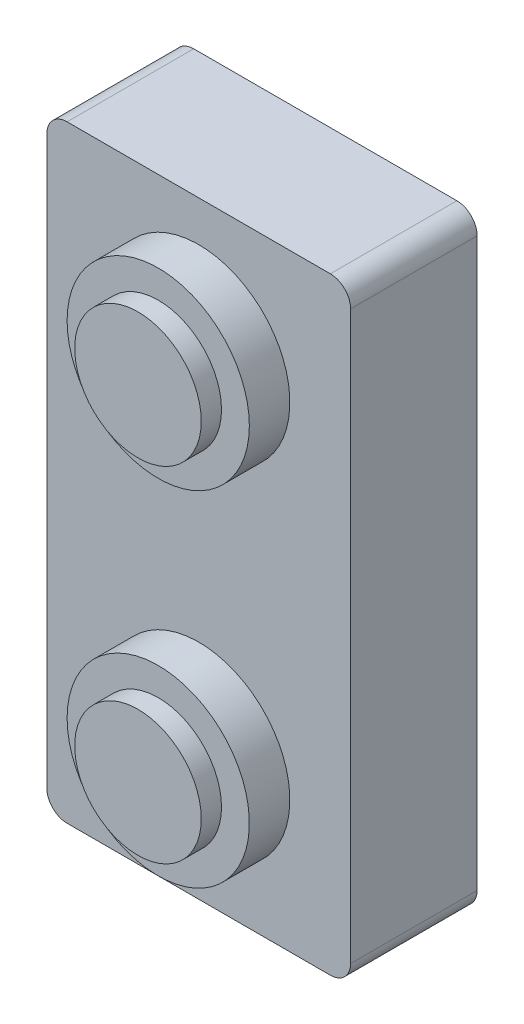
ISO-10303-21;
HEADER;
FILE_DESCRIPTION(('STEP AP214'),'2;1');
FILE_NAME('part.step','',(''),(''),'','','');
FILE_SCHEMA(('AUTOMOTIVE_DESIGN { 1 0 10303 214 1 1 1 1 }'));
ENDSEC;
DATA;
#1=APPLICATION_CONTEXT('core data for automotive mechanical design processes');
#2=APPLICATION_PROTOCOL_DEFINITION('international standard','automotive_design',2000,#1);
#3=PRODUCT_CONTEXT('',#1,'mechanical');
#4=PRODUCT('Part','Part','',(#3));
#5=PRODUCT_RELATED_PRODUCT_CATEGORY('part','',(#4));
#6=PRODUCT_DEFINITION_FORMATION('','',#4);
#7=PRODUCT_DEFINITION_CONTEXT('part definition',#1,'design');
#8=PRODUCT_DEFINITION('design','',#6,#7);
#9=PRODUCT_DEFINITION_SHAPE('','',#8);
#10=(LENGTH_UNIT() NAMED_UNIT(*) SI_UNIT(.MILLI.,.METRE.));
#11=(NAMED_UNIT(*) PLANE_ANGLE_UNIT() SI_UNIT($,.RADIAN.));
#12=(NAMED_UNIT(*) SI_UNIT($,.STERADIAN.) SOLID_ANGLE_UNIT());
#13=UNCERTAINTY_MEASURE_WITH_UNIT(LENGTH_MEASURE(1.E-05),#10,'distance_accuracy_value','');
#14=(GEOMETRIC_REPRESENTATION_CONTEXT(3) GLOBAL_UNCERTAINTY_ASSIGNED_CONTEXT((#13)) GLOBAL_UNIT_ASSIGNED_CONTEXT((#10,
#11,#12)) REPRESENTATION_CONTEXT('',''));
#15=CARTESIAN_POINT('',(0.,0.,0.));
#16=DIRECTION('',(0.,0.,1.));
#17=DIRECTION('',(1.,0.,0.));
#18=AXIS2_PLACEMENT_3D('',#15,#16,#17);
#19=CARTESIAN_POINT('',(15.,30.,12.5));
#20=DIRECTION('',(-1.,0.,0.));
#21=DIRECTION('',(0.,-1.,0.));
#22=AXIS2_PLACEMENT_3D('',#19,#20,#21);
#23=PLANE('',#22);
#24=DIRECTION('',(0.,1.,0.));
#25=VECTOR('',#24,1.);
#26=CARTESIAN_POINT('',(15.,30.,0.));
#27=LINE('',#26,#25);
#28=CARTESIAN_POINT('',(15.,-28.,0.));
#29=VERTEX_POINT('',#28);
#30=CARTESIAN_POINT('',(15.,28.,0.));
#31=VERTEX_POINT('',#30);
#32=EDGE_CURVE('E136',#29,#31,#27,.T.);
#33=ORIENTED_EDGE('',*,*,#32,.T.);
#34=DIRECTION('',(0.,0.,-1.));
#35=VECTOR('',#34,1.);
#36=CARTESIAN_POINT('',(15.,28.,12.5));
#37=LINE('',#36,#35);
#38=CARTESIAN_POINT('',(15.,28.,12.5));
#39=VERTEX_POINT('',#38);
#40=EDGE_CURVE('E166',#31,#39,#37,.F.);
#41=ORIENTED_EDGE('',*,*,#40,.T.);
#42=DIRECTION('',(0.,1.,0.));
#43=VECTOR('',#42,1.);
#44=CARTESIAN_POINT('',(15.,30.,12.5));
#45=LINE('',#44,#43);
#46=CARTESIAN_POINT('',(15.,-28.,12.5));
#47=VERTEX_POINT('',#46);
#48=EDGE_CURVE('E134',#47,#39,#45,.T.);
#49=ORIENTED_EDGE('',*,*,#48,.F.);
#50=DIRECTION('',(0.,0.,-1.));
#51=VECTOR('',#50,1.);
#52=CARTESIAN_POINT('',(15.,-28.,12.5));
#53=LINE('',#52,#51);
#54=EDGE_CURVE('E163',#47,#29,#53,.T.);
#55=ORIENTED_EDGE('',*,*,#54,.T.);
#56=EDGE_LOOP('',(#33,#41,#49,#55));
#57=FACE_BOUND('',#56,.T.);
#58=ADVANCED_FACE('F39',(#57),#23,.F.);
#59=CARTESIAN_POINT('',(15.,30.,12.5));
#60=DIRECTION('',(0.,-1.,0.));
#61=DIRECTION('',(1.,0.,0.));
#62=AXIS2_PLACEMENT_3D('',#59,#60,#61);
#63=PLANE('',#62);
#64=DIRECTION('',(-1.,0.,0.));
#65=VECTOR('',#64,1.);
#66=CARTESIAN_POINT('',(15.,30.,0.));
#67=LINE('',#66,#65);
#68=CARTESIAN_POINT('',(13.,30.,0.));
#69=VERTEX_POINT('',#68);
#70=CARTESIAN_POINT('',(-13.,30.,0.));
#71=VERTEX_POINT('',#70);
#72=EDGE_CURVE('E132',#69,#71,#67,.T.);
#73=ORIENTED_EDGE('',*,*,#72,.T.);
#74=DIRECTION('',(0.,0.,-1.));
#75=VECTOR('',#74,1.);
#76=CARTESIAN_POINT('',(-13.,30.,12.5));
#77=LINE('',#76,#75);
#78=CARTESIAN_POINT('',(-13.,30.,12.5));
#79=VERTEX_POINT('',#78);
#80=EDGE_CURVE('E110',#71,#79,#77,.F.);
#81=ORIENTED_EDGE('',*,*,#80,.T.);
#82=DIRECTION('',(-1.,0.,0.));
#83=VECTOR('',#82,1.);
#84=CARTESIAN_POINT('',(15.,30.,12.5));
#85=LINE('',#84,#83);
#86=CARTESIAN_POINT('',(13.,30.,12.5));
#87=VERTEX_POINT('',#86);
#88=EDGE_CURVE('E180',#87,#79,#85,.T.);
#89=ORIENTED_EDGE('',*,*,#88,.F.);
#90=DIRECTION('',(0.,0.,-1.));
#91=VECTOR('',#90,1.);
#92=CARTESIAN_POINT('',(13.,30.,12.5));
#93=LINE('',#92,#91);
#94=EDGE_CURVE('E115',#87,#69,#93,.T.);
#95=ORIENTED_EDGE('',*,*,#94,.T.);
#96=EDGE_LOOP('',(#73,#81,#89,#95));
#97=FACE_BOUND('',#96,.T.);
#98=ADVANCED_FACE('F185',(#97),#63,.F.);
#99=CARTESIAN_POINT('',(-15.,30.,12.5));
#100=DIRECTION('',(1.,0.,0.));
#101=DIRECTION('',(0.,0.,-1.));
#102=AXIS2_PLACEMENT_3D('',#99,#100,#101);
#103=PLANE('',#102);
#104=CARTESIAN_POINT('',(-15.,0.,6.25));
#105=DIRECTION('',(-1.,0.,0.));
#106=DIRECTION('',(0.,0.,1.));
#107=AXIS2_PLACEMENT_3D('',#104,#105,#106);
#108=CIRCLE('',#107,4.);
#109=CARTESIAN_POINT('',(-15.,0.,10.25));
#110=VERTEX_POINT('',#109);
#111=EDGE_CURVE('E207',#110,#110,#108,.T.);
#112=ORIENTED_EDGE('',*,*,#111,.F.);
#113=EDGE_LOOP('',(#112));
#114=FACE_BOUND('',#113,.T.);
#115=DIRECTION('',(0.,-1.,0.));
#116=VECTOR('',#115,1.);
#117=CARTESIAN_POINT('',(-15.,30.,12.5));
#118=LINE('',#117,#116);
#119=CARTESIAN_POINT('',(-15.,28.,12.5));
#120=VERTEX_POINT('',#119);
#121=CARTESIAN_POINT('',(-15.,-28.,12.5));
#122=VERTEX_POINT('',#121);
#123=EDGE_CURVE('E124',#120,#122,#118,.T.);
#124=ORIENTED_EDGE('',*,*,#123,.F.);
#125=DIRECTION('',(0.,0.,-1.));
#126=VECTOR('',#125,1.);
#127=CARTESIAN_POINT('',(-15.,28.,12.5));
#128=LINE('',#127,#126);
#129=CARTESIAN_POINT('',(-15.,28.,0.));
#130=VERTEX_POINT('',#129);
#131=EDGE_CURVE('E109',#120,#130,#128,.T.);
#132=ORIENTED_EDGE('',*,*,#131,.T.);
#133=DIRECTION('',(0.,-1.,0.));
#134=VECTOR('',#133,1.);
#135=CARTESIAN_POINT('',(-15.,30.,0.));
#136=LINE('',#135,#134);
#137=CARTESIAN_POINT('',(-15.,-28.,0.));
#138=VERTEX_POINT('',#137);
#139=EDGE_CURVE('E122',#130,#138,#136,.T.);
#140=ORIENTED_EDGE('',*,*,#139,.T.);
#141=DIRECTION('',(0.,0.,-1.));
#142=VECTOR('',#141,1.);
#143=CARTESIAN_POINT('',(-15.,-28.,12.5));
#144=LINE('',#143,#142);
#145=EDGE_CURVE('E126',#138,#122,#144,.F.);
#146=ORIENTED_EDGE('',*,*,#145,.T.);
#147=EDGE_LOOP('',(#124,#132,#140,#146));
#148=FACE_BOUND('',#147,.T.);
#149=ADVANCED_FACE('F121',(#114,#148),#103,.F.);
#150=CARTESIAN_POINT('',(15.,-30.,12.5));
#151=DIRECTION('',(0.,1.,0.));
#152=DIRECTION('',(-1.,0.,0.));
#153=AXIS2_PLACEMENT_3D('',#150,#151,#152);
#154=PLANE('',#153);
#155=DIRECTION('',(1.,0.,0.));
#156=VECTOR('',#155,1.);
#157=CARTESIAN_POINT('',(15.,-30.,12.5));
#158=LINE('',#157,#156);
#159=CARTESIAN_POINT('',(-13.,-30.,12.5));
#160=VERTEX_POINT('',#159);
#161=CARTESIAN_POINT('',(13.,-30.,12.5));
#162=VERTEX_POINT('',#161);
#163=EDGE_CURVE('E144',#160,#162,#158,.T.);
#164=ORIENTED_EDGE('',*,*,#163,.F.);
#165=DIRECTION('',(0.,0.,-1.));
#166=VECTOR('',#165,1.);
#167=CARTESIAN_POINT('',(-13.,-30.,12.5));
#168=LINE('',#167,#166);
#169=CARTESIAN_POINT('',(-13.,-30.,0.));
#170=VERTEX_POINT('',#169);
#171=EDGE_CURVE('E11',#160,#170,#168,.T.);
#172=ORIENTED_EDGE('',*,*,#171,.T.);
#173=DIRECTION('',(1.,0.,0.));
#174=VECTOR('',#173,1.);
#175=CARTESIAN_POINT('',(15.,-30.,0.));
#176=LINE('',#175,#174);
#177=CARTESIAN_POINT('',(13.,-30.,0.));
#178=VERTEX_POINT('',#177);
#179=EDGE_CURVE('E131',#170,#178,#176,.T.);
#180=ORIENTED_EDGE('',*,*,#179,.T.);
#181=DIRECTION('',(0.,0.,-1.));
#182=VECTOR('',#181,1.);
#183=CARTESIAN_POINT('',(13.,-30.,12.5));
#184=LINE('',#183,#182);
#185=EDGE_CURVE('E47',#178,#162,#184,.F.);
#186=ORIENTED_EDGE('',*,*,#185,.T.);
#187=EDGE_LOOP('',(#164,#172,#180,#186));
#188=FACE_BOUND('',#187,.T.);
#189=ADVANCED_FACE('F222',(#188),#154,.F.);
#190=CARTESIAN_POINT('',(0.,0.,12.5));
#191=DIRECTION('',(0.,0.,-1.));
#192=DIRECTION('',(-1.,0.,0.));
#193=AXIS2_PLACEMENT_3D('',#190,#191,#192);
#194=PLANE('',#193);
#195=CARTESIAN_POINT('',(0.,-17.,12.5));
#196=DIRECTION('',(0.,0.,-1.));
#197=DIRECTION('',(-1.,0.,0.));
#198=AXIS2_PLACEMENT_3D('',#195,#196,#197);
#199=CIRCLE('',#198,9.);
#200=CARTESIAN_POINT('',(-9.,-17.,12.5));
#201=VERTEX_POINT('',#200);
#202=EDGE_CURVE('E143',#201,#201,#199,.F.);
#203=ORIENTED_EDGE('',*,*,#202,.F.);
#204=EDGE_LOOP('',(#203));
#205=FACE_BOUND('',#204,.T.);
#206=CARTESIAN_POINT('',(0.,17.,12.5));
#207=DIRECTION('',(0.,0.,-1.));
#208=DIRECTION('',(-1.,0.,0.));
#209=AXIS2_PLACEMENT_3D('',#206,#207,#208);
#210=CIRCLE('',#209,9.);
#211=CARTESIAN_POINT('',(-9.,17.,12.5));
#212=VERTEX_POINT('',#211);
#213=EDGE_CURVE('E140',#212,#212,#210,.F.);
#214=ORIENTED_EDGE('',*,*,#213,.F.);
#215=EDGE_LOOP('',(#214));
#216=FACE_BOUND('',#215,.T.);
#217=ORIENTED_EDGE('',*,*,#88,.T.);
#218=CARTESIAN_POINT('',(-13.,28.,12.5));
#219=DIRECTION('',(0.,0.,-1.));
#220=DIRECTION('',(-1.,0.,0.));
#221=AXIS2_PLACEMENT_3D('',#218,#219,#220);
#222=CIRCLE('',#221,2.);
#223=EDGE_CURVE('E161',#79,#120,#222,.F.);
#224=ORIENTED_EDGE('',*,*,#223,.T.);
#225=ORIENTED_EDGE('',*,*,#123,.T.);
#226=CARTESIAN_POINT('',(-13.,-28.,12.5));
#227=DIRECTION('',(0.,0.,-1.));
#228=DIRECTION('',(-1.,0.,0.));
#229=AXIS2_PLACEMENT_3D('',#226,#227,#228);
#230=CIRCLE('',#229,2.);
#231=EDGE_CURVE('E60',#122,#160,#230,.F.);
#232=ORIENTED_EDGE('',*,*,#231,.T.);
#233=ORIENTED_EDGE('',*,*,#163,.T.);
#234=CARTESIAN_POINT('',(13.,-28.,12.5));
#235=DIRECTION('',(0.,0.,-1.));
#236=DIRECTION('',(-1.,0.,0.));
#237=AXIS2_PLACEMENT_3D('',#234,#235,#236);
#238=CIRCLE('',#237,2.);
#239=EDGE_CURVE('E156',#162,#47,#238,.F.);
#240=ORIENTED_EDGE('',*,*,#239,.T.);
#241=ORIENTED_EDGE('',*,*,#48,.T.);
#242=CARTESIAN_POINT('',(13.,28.,12.5));
#243=DIRECTION('',(0.,0.,-1.));
#244=DIRECTION('',(-1.,0.,0.));
#245=AXIS2_PLACEMENT_3D('',#242,#243,#244);
#246=CIRCLE('',#245,2.);
#247=EDGE_CURVE('E159',#39,#87,#246,.F.);
#248=ORIENTED_EDGE('',*,*,#247,.T.);
#249=EDGE_LOOP('',(#217,#224,#225,#232,#233,#240,#241,#248));
#250=FACE_BOUND('',#249,.T.);
#251=ADVANCED_FACE('F177',(#205,#216,#250),#194,.F.);
#252=CARTESIAN_POINT('',(0.,0.,0.));
#253=DIRECTION('',(0.,0.,-1.));
#254=DIRECTION('',(-1.,0.,0.));
#255=AXIS2_PLACEMENT_3D('',#252,#253,#254);
#256=PLANE('',#255);
#257=ORIENTED_EDGE('',*,*,#139,.F.);
#258=CARTESIAN_POINT('',(-13.,28.,0.));
#259=DIRECTION('',(0.,0.,-1.));
#260=DIRECTION('',(-1.,0.,0.));
#261=AXIS2_PLACEMENT_3D('',#258,#259,#260);
#262=CIRCLE('',#261,2.);
#263=EDGE_CURVE('E105',#130,#71,#262,.T.);
#264=ORIENTED_EDGE('',*,*,#263,.T.);
#265=ORIENTED_EDGE('',*,*,#72,.F.);
#266=CARTESIAN_POINT('',(13.,28.,0.));
#267=DIRECTION('',(0.,0.,-1.));
#268=DIRECTION('',(-1.,0.,0.));
#269=AXIS2_PLACEMENT_3D('',#266,#267,#268);
#270=CIRCLE('',#269,2.);
#271=EDGE_CURVE('E116',#69,#31,#270,.T.);
#272=ORIENTED_EDGE('',*,*,#271,.T.);
#273=ORIENTED_EDGE('',*,*,#32,.F.);
#274=CARTESIAN_POINT('',(13.,-28.,0.));
#275=DIRECTION('',(0.,0.,-1.));
#276=DIRECTION('',(-1.,0.,0.));
#277=AXIS2_PLACEMENT_3D('',#274,#275,#276);
#278=CIRCLE('',#277,2.);
#279=EDGE_CURVE('E125',#29,#178,#278,.T.);
#280=ORIENTED_EDGE('',*,*,#279,.T.);
#281=ORIENTED_EDGE('',*,*,#179,.F.);
#282=CARTESIAN_POINT('',(-13.,-28.,0.));
#283=DIRECTION('',(0.,0.,-1.));
#284=DIRECTION('',(-1.,0.,0.));
#285=AXIS2_PLACEMENT_3D('',#282,#283,#284);
#286=CIRCLE('',#285,2.);
#287=EDGE_CURVE('E130',#170,#138,#286,.T.);
#288=ORIENTED_EDGE('',*,*,#287,.T.);
#289=EDGE_LOOP('',(#257,#264,#265,#272,#273,#280,#281,#288));
#290=FACE_BOUND('',#289,.T.);
#291=ADVANCED_FACE('F128',(#290),#256,.T.);
#292=CARTESIAN_POINT('',(0.,17.,16.5));
#293=DIRECTION('',(0.,0.,-1.));
#294=DIRECTION('',(-1.,0.,0.));
#295=AXIS2_PLACEMENT_3D('',#292,#293,#294);
#296=CYLINDRICAL_SURFACE('',#295,9.);
#297=CARTESIAN_POINT('',(0.,17.,16.5));
#298=DIRECTION('',(0.,0.,1.));
#299=DIRECTION('',(1.,0.,0.));
#300=AXIS2_PLACEMENT_3D('',#297,#298,#299);
#301=CIRCLE('',#300,9.);
#302=CARTESIAN_POINT('',(9.,17.,16.5));
#303=VERTEX_POINT('',#302);
#304=EDGE_CURVE('E186',#303,#303,#301,.T.);
#305=ORIENTED_EDGE('',*,*,#304,.F.);
#306=EDGE_LOOP('',(#305));
#307=FACE_BOUND('',#306,.T.);
#308=ORIENTED_EDGE('',*,*,#213,.T.);
#309=EDGE_LOOP('',(#308));
#310=FACE_BOUND('',#309,.T.);
#311=ADVANCED_FACE('F379',(#307,#310),#296,.T.);
#312=CARTESIAN_POINT('',(0.,17.,16.5));
#313=DIRECTION('',(0.,0.,1.));
#314=DIRECTION('',(1.,0.,0.));
#315=AXIS2_PLACEMENT_3D('',#312,#313,#314);
#316=PLANE('',#315);
#317=CARTESIAN_POINT('',(0.,17.,16.5));
#318=DIRECTION('',(0.,0.,1.));
#319=DIRECTION('',(1.,0.,0.));
#320=AXIS2_PLACEMENT_3D('',#317,#318,#319);
#321=CIRCLE('',#320,6.25);
#322=CARTESIAN_POINT('',(6.25,17.,16.5));
#323=VERTEX_POINT('',#322);
#324=EDGE_CURVE('E147',#323,#323,#321,.T.);
#325=ORIENTED_EDGE('',*,*,#324,.F.);
#326=EDGE_LOOP('',(#325));
#327=FACE_BOUND('',#326,.T.);
#328=ORIENTED_EDGE('',*,*,#304,.T.);
#329=EDGE_LOOP('',(#328));
#330=FACE_BOUND('',#329,.T.);
#331=ADVANCED_FACE('F368',(#327,#330),#316,.T.);
#332=CARTESIAN_POINT('',(0.,-17.,16.5));
#333=DIRECTION('',(0.,0.,-1.));
#334=DIRECTION('',(-1.,0.,0.));
#335=AXIS2_PLACEMENT_3D('',#332,#333,#334);
#336=CYLINDRICAL_SURFACE('',#335,9.);
#337=CARTESIAN_POINT('',(0.,-17.,16.5));
#338=DIRECTION('',(0.,0.,1.));
#339=DIRECTION('',(-1.,0.,0.));
#340=AXIS2_PLACEMENT_3D('',#337,#338,#339);
#341=CIRCLE('',#340,9.);
#342=CARTESIAN_POINT('',(-9.,-17.,16.5));
#343=VERTEX_POINT('',#342);
#344=EDGE_CURVE('E188',#343,#343,#341,.T.);
#345=ORIENTED_EDGE('',*,*,#344,.F.);
#346=EDGE_LOOP('',(#345));
#347=FACE_BOUND('',#346,.T.);
#348=ORIENTED_EDGE('',*,*,#202,.T.);
#349=EDGE_LOOP('',(#348));
#350=FACE_BOUND('',#349,.T.);
#351=ADVANCED_FACE('F356',(#347,#350),#336,.T.);
#352=CARTESIAN_POINT('',(0.,-17.,16.5));
#353=DIRECTION('',(0.,0.,-1.));
#354=DIRECTION('',(-1.,0.,0.));
#355=AXIS2_PLACEMENT_3D('',#352,#353,#354);
#356=PLANE('',#355);
#357=CARTESIAN_POINT('',(0.,-17.,16.5));
#358=DIRECTION('',(0.,0.,1.));
#359=DIRECTION('',(1.,0.,0.));
#360=AXIS2_PLACEMENT_3D('',#357,#358,#359);
#361=CIRCLE('',#360,6.25);
#362=CARTESIAN_POINT('',(6.25,-17.,16.5));
#363=VERTEX_POINT('',#362);
#364=EDGE_CURVE('E148',#363,#363,#361,.T.);
#365=ORIENTED_EDGE('',*,*,#364,.F.);
#366=EDGE_LOOP('',(#365));
#367=FACE_BOUND('',#366,.T.);
#368=ORIENTED_EDGE('',*,*,#344,.T.);
#369=EDGE_LOOP('',(#368));
#370=FACE_BOUND('',#369,.T.);
#371=ADVANCED_FACE('F345',(#367,#370),#356,.F.);
#372=CARTESIAN_POINT('',(0.,17.,18.5));
#373=DIRECTION('',(0.,0.,-1.));
#374=DIRECTION('',(-1.,0.,0.));
#375=AXIS2_PLACEMENT_3D('',#372,#373,#374);
#376=CYLINDRICAL_SURFACE('',#375,6.25);
#377=CARTESIAN_POINT('',(0.,17.,18.5));
#378=DIRECTION('',(0.,0.,1.));
#379=DIRECTION('',(1.,0.,0.));
#380=AXIS2_PLACEMENT_3D('',#377,#378,#379);
#381=CIRCLE('',#380,6.25);
#382=CARTESIAN_POINT('',(6.25,17.,18.5));
#383=VERTEX_POINT('',#382);
#384=EDGE_CURVE('E196',#383,#383,#381,.T.);
#385=ORIENTED_EDGE('',*,*,#384,.F.);
#386=EDGE_LOOP('',(#385));
#387=FACE_BOUND('',#386,.T.);
#388=ORIENTED_EDGE('',*,*,#324,.T.);
#389=EDGE_LOOP('',(#388));
#390=FACE_BOUND('',#389,.T.);
#391=ADVANCED_FACE('F334',(#387,#390),#376,.T.);
#392=CARTESIAN_POINT('',(0.,17.,18.5));
#393=DIRECTION('',(0.,0.,1.));
#394=DIRECTION('',(1.,0.,0.));
#395=AXIS2_PLACEMENT_3D('',#392,#393,#394);
#396=PLANE('',#395);
#397=ORIENTED_EDGE('',*,*,#384,.T.);
#398=EDGE_LOOP('',(#397));
#399=FACE_BOUND('',#398,.T.);
#400=ADVANCED_FACE('F323',(#399),#396,.T.);
#401=CARTESIAN_POINT('',(0.,-17.,18.5));
#402=DIRECTION('',(0.,0.,-1.));
#403=DIRECTION('',(-1.,0.,0.));
#404=AXIS2_PLACEMENT_3D('',#401,#402,#403);
#405=CYLINDRICAL_SURFACE('',#404,6.25);
#406=CARTESIAN_POINT('',(0.,-17.,18.5));
#407=DIRECTION('',(0.,0.,1.));
#408=DIRECTION('',(1.,0.,0.));
#409=AXIS2_PLACEMENT_3D('',#406,#407,#408);
#410=CIRCLE('',#409,6.25);
#411=CARTESIAN_POINT('',(6.25,-17.,18.5));
#412=VERTEX_POINT('',#411);
#413=EDGE_CURVE('E201',#412,#412,#410,.T.);
#414=ORIENTED_EDGE('',*,*,#413,.F.);
#415=EDGE_LOOP('',(#414));
#416=FACE_BOUND('',#415,.T.);
#417=ORIENTED_EDGE('',*,*,#364,.T.);
#418=EDGE_LOOP('',(#417));
#419=FACE_BOUND('',#418,.T.);
#420=ADVANCED_FACE('F312',(#416,#419),#405,.T.);
#421=CARTESIAN_POINT('',(0.,-17.,18.5));
#422=DIRECTION('',(0.,0.,1.));
#423=DIRECTION('',(1.,0.,0.));
#424=AXIS2_PLACEMENT_3D('',#421,#422,#423);
#425=PLANE('',#424);
#426=ORIENTED_EDGE('',*,*,#413,.T.);
#427=EDGE_LOOP('',(#426));
#428=FACE_BOUND('',#427,.T.);
#429=ADVANCED_FACE('F237',(#428),#425,.T.);
#430=CARTESIAN_POINT('',(-13.,28.,12.5));
#431=DIRECTION('',(0.,0.,-1.));
#432=DIRECTION('',(-1.,0.,0.));
#433=AXIS2_PLACEMENT_3D('',#430,#431,#432);
#434=CYLINDRICAL_SURFACE('',#433,2.);
#435=ORIENTED_EDGE('',*,*,#223,.F.);
#436=ORIENTED_EDGE('',*,*,#80,.F.);
#437=ORIENTED_EDGE('',*,*,#263,.F.);
#438=ORIENTED_EDGE('',*,*,#131,.F.);
#439=EDGE_LOOP('',(#435,#436,#437,#438));
#440=FACE_BOUND('',#439,.T.);
#441=ADVANCED_FACE('F108',(#440),#434,.T.);
#442=CARTESIAN_POINT('',(13.,28.,12.5));
#443=DIRECTION('',(0.,0.,-1.));
#444=DIRECTION('',(-1.,0.,0.));
#445=AXIS2_PLACEMENT_3D('',#442,#443,#444);
#446=CYLINDRICAL_SURFACE('',#445,2.);
#447=ORIENTED_EDGE('',*,*,#247,.F.);
#448=ORIENTED_EDGE('',*,*,#40,.F.);
#449=ORIENTED_EDGE('',*,*,#271,.F.);
#450=ORIENTED_EDGE('',*,*,#94,.F.);
#451=EDGE_LOOP('',(#447,#448,#449,#450));
#452=FACE_BOUND('',#451,.T.);
#453=ADVANCED_FACE('F183',(#452),#446,.T.);
#454=CARTESIAN_POINT('',(-13.,-28.,12.5));
#455=DIRECTION('',(0.,0.,-1.));
#456=DIRECTION('',(-1.,0.,0.));
#457=AXIS2_PLACEMENT_3D('',#454,#455,#456);
#458=CYLINDRICAL_SURFACE('',#457,2.);
#459=ORIENTED_EDGE('',*,*,#231,.F.);
#460=ORIENTED_EDGE('',*,*,#145,.F.);
#461=ORIENTED_EDGE('',*,*,#287,.F.);
#462=ORIENTED_EDGE('',*,*,#171,.F.);
#463=EDGE_LOOP('',(#459,#460,#461,#462));
#464=FACE_BOUND('',#463,.T.);
#465=ADVANCED_FACE('F239',(#464),#458,.T.);
#466=CARTESIAN_POINT('',(13.,-28.,12.5));
#467=DIRECTION('',(0.,0.,-1.));
#468=DIRECTION('',(-1.,0.,0.));
#469=AXIS2_PLACEMENT_3D('',#466,#467,#468);
#470=CYLINDRICAL_SURFACE('',#469,2.);
#471=ORIENTED_EDGE('',*,*,#239,.F.);
#472=ORIENTED_EDGE('',*,*,#185,.F.);
#473=ORIENTED_EDGE('',*,*,#279,.F.);
#474=ORIENTED_EDGE('',*,*,#54,.F.);
#475=EDGE_LOOP('',(#471,#472,#473,#474));
#476=FACE_BOUND('',#475,.T.);
#477=ADVANCED_FACE('F41',(#476),#470,.T.);
#478=CARTESIAN_POINT('',(-5.,0.,6.25));
#479=DIRECTION('',(-1.,0.,0.));
#480=DIRECTION('',(0.,0.,1.));
#481=AXIS2_PLACEMENT_3D('',#478,#479,#480);
#482=CYLINDRICAL_SURFACE('',#481,4.);
#483=CARTESIAN_POINT('',(-5.,0.,6.25));
#484=DIRECTION('',(-1.,0.,0.));
#485=DIRECTION('',(0.,0.,1.));
#486=AXIS2_PLACEMENT_3D('',#483,#484,#485);
#487=CIRCLE('',#486,4.);
#488=CARTESIAN_POINT('',(-5.,0.,10.25));
#489=VERTEX_POINT('',#488);
#490=EDGE_CURVE('E204',#489,#489,#487,.T.);
#491=ORIENTED_EDGE('',*,*,#490,.F.);
#492=EDGE_LOOP('',(#491));
#493=FACE_BOUND('',#492,.T.);
#494=ORIENTED_EDGE('',*,*,#111,.T.);
#495=EDGE_LOOP('',(#494));
#496=FACE_BOUND('',#495,.T.);
#497=ADVANCED_FACE('F215',(#493,#496),#482,.F.);
#498=CARTESIAN_POINT('',(-5.,0.,0.));
#499=DIRECTION('',(-1.,0.,0.));
#500=DIRECTION('',(0.,0.,1.));
#501=AXIS2_PLACEMENT_3D('',#498,#499,#500);
#502=PLANE('',#501);
#503=ORIENTED_EDGE('',*,*,#490,.T.);
#504=EDGE_LOOP('',(#503));
#505=FACE_BOUND('',#504,.T.);
#506=ADVANCED_FACE('F213',(#505),#502,.T.);
#507=CLOSED_SHELL('',(#58,#98,#149,#189,#251,#291,#311,#331,#351,#371,#391,#400,#420,#429,#441,
#453,#465,#477,#497,#506));
#508=MANIFOLD_SOLID_BREP('B2',#507);
#509=ADVANCED_BREP_SHAPE_REPRESENTATION('',(#18,#508),#14);
#510=SHAPE_DEFINITION_REPRESENTATION(#9,#509);
ENDSEC;
END-ISO-10303-21;
